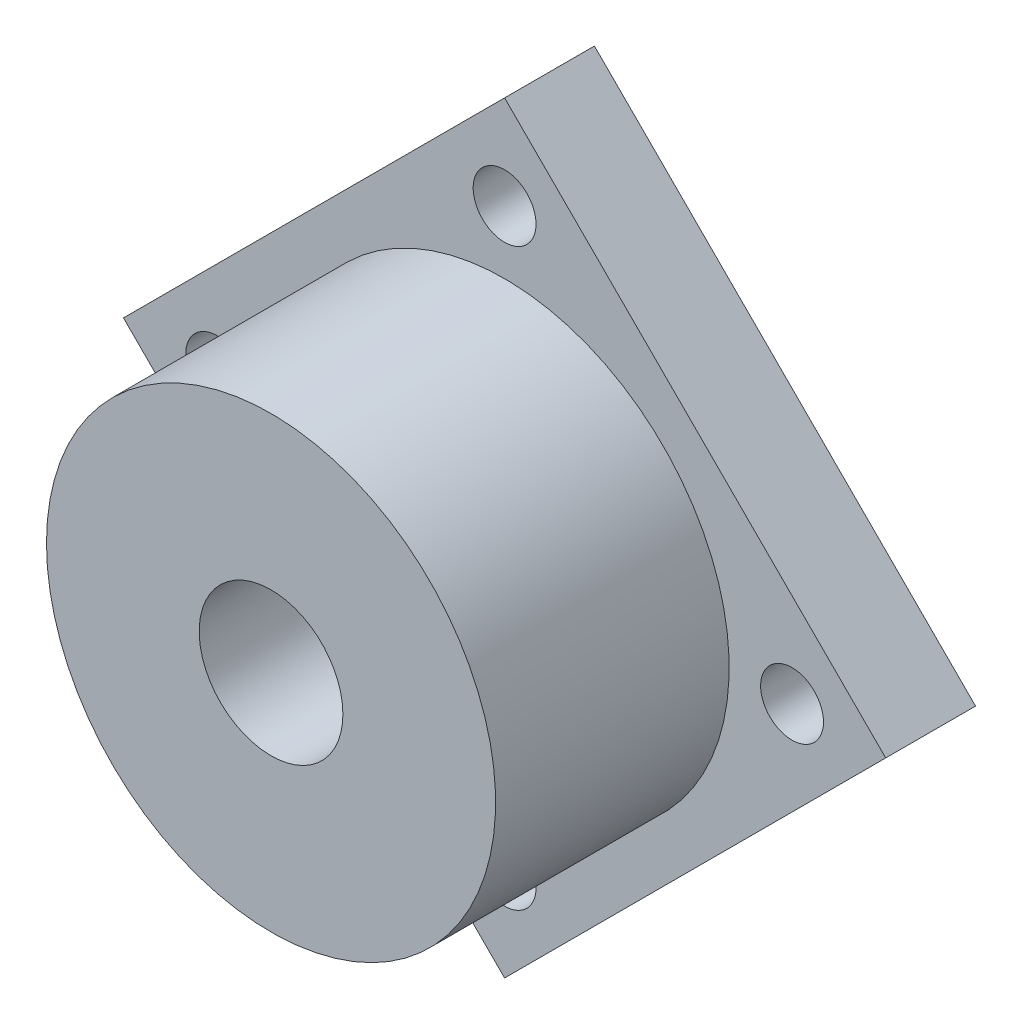
ISO-10303-21;
HEADER;
FILE_DESCRIPTION(('STEP AP214'),'2;1');
FILE_NAME('part.step','',(''),(''),'','','');
FILE_SCHEMA(('AUTOMOTIVE_DESIGN { 1 0 10303 214 1 1 1 1 }'));
ENDSEC;
DATA;
#1=APPLICATION_CONTEXT('core data for automotive mechanical design processes');
#2=APPLICATION_PROTOCOL_DEFINITION('international standard','automotive_design',2000,#1);
#3=PRODUCT_CONTEXT('',#1,'mechanical');
#4=PRODUCT('Part','Part','',(#3));
#5=PRODUCT_RELATED_PRODUCT_CATEGORY('part','',(#4));
#6=PRODUCT_DEFINITION_FORMATION('','',#4);
#7=PRODUCT_DEFINITION_CONTEXT('part definition',#1,'design');
#8=PRODUCT_DEFINITION('design','',#6,#7);
#9=PRODUCT_DEFINITION_SHAPE('','',#8);
#10=(LENGTH_UNIT() NAMED_UNIT(*) SI_UNIT(.MILLI.,.METRE.));
#11=(NAMED_UNIT(*) PLANE_ANGLE_UNIT() SI_UNIT($,.RADIAN.));
#12=(NAMED_UNIT(*) SI_UNIT($,.STERADIAN.) SOLID_ANGLE_UNIT());
#13=UNCERTAINTY_MEASURE_WITH_UNIT(LENGTH_MEASURE(1.E-05),#10,'distance_accuracy_value','');
#14=(GEOMETRIC_REPRESENTATION_CONTEXT(3) GLOBAL_UNCERTAINTY_ASSIGNED_CONTEXT((#13)) GLOBAL_UNIT_ASSIGNED_CONTEXT((#10,
#11,#12)) REPRESENTATION_CONTEXT('',''));
#15=CARTESIAN_POINT('',(0.,0.,0.));
#16=DIRECTION('',(0.,0.,1.));
#17=DIRECTION('',(1.,0.,0.));
#18=AXIS2_PLACEMENT_3D('',#15,#16,#17);
#19=CARTESIAN_POINT('',(0.,0.,5.));
#20=DIRECTION('',(0.,0.,1.));
#21=DIRECTION('',(1.,0.,0.));
#22=AXIS2_PLACEMENT_3D('',#19,#20,#21);
#23=PLANE('',#22);
#24=CARTESIAN_POINT('',(0.,0.,5.));
#25=DIRECTION('',(0.,0.,1.));
#26=DIRECTION('',(1.,0.,0.));
#27=AXIS2_PLACEMENT_3D('',#24,#25,#26);
#28=CIRCLE('',#27,12.5);
#29=CARTESIAN_POINT('',(-12.5,0.,5.));
#30=VERTEX_POINT('',#29);
#31=EDGE_CURVE('E11',#30,#30,#28,.T.);
#32=ORIENTED_EDGE('',*,*,#31,.F.);
#33=EDGE_LOOP('',(#32));
#34=FACE_BOUND('',#33,.T.);
#35=CARTESIAN_POINT('',(16.,0.,5.));
#36=DIRECTION('',(0.,0.,1.));
#37=DIRECTION('',(1.,0.,0.));
#38=AXIS2_PLACEMENT_3D('',#35,#36,#37);
#39=CIRCLE('',#38,1.75);
#40=CARTESIAN_POINT('',(17.75,0.,5.));
#41=VERTEX_POINT('',#40);
#42=EDGE_CURVE('E144',#41,#41,#39,.T.);
#43=ORIENTED_EDGE('',*,*,#42,.F.);
#44=EDGE_LOOP('',(#43));
#45=FACE_BOUND('',#44,.T.);
#46=CARTESIAN_POINT('',(0.,-16.,5.));
#47=DIRECTION('',(0.,0.,1.));
#48=DIRECTION('',(1.,0.,0.));
#49=AXIS2_PLACEMENT_3D('',#46,#47,#48);
#50=CIRCLE('',#49,1.75);
#51=CARTESIAN_POINT('',(1.74999999999994,-16.,5.));
#52=VERTEX_POINT('',#51);
#53=EDGE_CURVE('E141',#52,#52,#50,.T.);
#54=ORIENTED_EDGE('',*,*,#53,.F.);
#55=EDGE_LOOP('',(#54));
#56=FACE_BOUND('',#55,.T.);
#57=CARTESIAN_POINT('',(-16.,1.1172740284298E-13,5.));
#58=DIRECTION('',(0.,0.,1.));
#59=DIRECTION('',(1.,0.,0.));
#60=AXIS2_PLACEMENT_3D('',#57,#58,#59);
#61=CIRCLE('',#60,1.75);
#62=CARTESIAN_POINT('',(-14.25,1.1172740284298E-13,5.));
#63=VERTEX_POINT('',#62);
#64=EDGE_CURVE('E135',#63,#63,#61,.T.);
#65=ORIENTED_EDGE('',*,*,#64,.F.);
#66=EDGE_LOOP('',(#65));
#67=FACE_BOUND('',#66,.T.);
#68=CARTESIAN_POINT('',(1.6759110426447E-13,16.,5.));
#69=DIRECTION('',(0.,0.,1.));
#70=DIRECTION('',(1.,0.,0.));
#71=AXIS2_PLACEMENT_3D('',#68,#69,#70);
#72=CIRCLE('',#71,1.75);
#73=CARTESIAN_POINT('',(1.75000000000017,16.,5.));
#74=VERTEX_POINT('',#73);
#75=EDGE_CURVE('E128',#74,#74,#72,.T.);
#76=ORIENTED_EDGE('',*,*,#75,.F.);
#77=EDGE_LOOP('',(#76));
#78=FACE_BOUND('',#77,.T.);
#79=DIRECTION('',(-0.707106781186551,0.707106781186544,0.));
#80=VECTOR('',#79,1.);
#81=CARTESIAN_POINT('',(21.2132034355965,2.20897577713052E-13,5.));
#82=LINE('',#81,#80);
#83=CARTESIAN_POINT('',(21.2132034355965,2.20897577713052E-13,5.));
#84=VERTEX_POINT('',#83);
#85=CARTESIAN_POINT('',(0.,21.2132034355965,5.));
#86=VERTEX_POINT('',#85);
#87=EDGE_CURVE('E94',#84,#86,#82,.T.);
#88=ORIENTED_EDGE('',*,*,#87,.T.);
#89=DIRECTION('',(-0.707106781186546,-0.707106781186549,0.));
#90=VECTOR('',#89,1.);
#91=CARTESIAN_POINT('',(0.,21.2132034355965,5.));
#92=LINE('',#91,#90);
#93=CARTESIAN_POINT('',(-21.2132034355965,0.,5.));
#94=VERTEX_POINT('',#93);
#95=EDGE_CURVE('E90',#86,#94,#92,.T.);
#96=ORIENTED_EDGE('',*,*,#95,.T.);
#97=DIRECTION('',(0.707106781186551,-0.707106781186544,0.));
#98=VECTOR('',#97,1.);
#99=CARTESIAN_POINT('',(-21.2132034355965,0.,5.));
#100=LINE('',#99,#98);
#101=CARTESIAN_POINT('',(1.48131007864937E-13,-21.2132034355965,5.));
#102=VERTEX_POINT('',#101);
#103=EDGE_CURVE('E92',#94,#102,#100,.T.);
#104=ORIENTED_EDGE('',*,*,#103,.T.);
#105=DIRECTION('',(0.707106781186541,0.707106781186554,0.));
#106=VECTOR('',#105,1.);
#107=CARTESIAN_POINT('',(1.48131007864937E-13,-21.2132034355965,5.));
#108=LINE('',#107,#106);
#109=EDGE_CURVE('E59',#102,#84,#108,.T.);
#110=ORIENTED_EDGE('',*,*,#109,.T.);
#111=EDGE_LOOP('',(#88,#96,#104,#110));
#112=FACE_BOUND('',#111,.T.);
#113=ADVANCED_FACE('F41',(#34,#45,#56,#67,#78,#112),#23,.T.);
#114=CARTESIAN_POINT('',(0.,0.,0.));
#115=DIRECTION('',(0.,0.,1.));
#116=DIRECTION('',(1.,0.,0.));
#117=AXIS2_PLACEMENT_3D('',#114,#115,#116);
#118=PLANE('',#117);
#119=CARTESIAN_POINT('',(16.,0.,0.));
#120=DIRECTION('',(0.,0.,1.));
#121=DIRECTION('',(1.,0.,0.));
#122=AXIS2_PLACEMENT_3D('',#119,#120,#121);
#123=CIRCLE('',#122,1.75);
#124=CARTESIAN_POINT('',(17.75,0.,0.));
#125=VERTEX_POINT('',#124);
#126=EDGE_CURVE('E124',#125,#125,#123,.T.);
#127=ORIENTED_EDGE('',*,*,#126,.T.);
#128=EDGE_LOOP('',(#127));
#129=FACE_BOUND('',#128,.T.);
#130=CARTESIAN_POINT('',(0.,-16.,0.));
#131=DIRECTION('',(0.,0.,1.));
#132=DIRECTION('',(1.,0.,0.));
#133=AXIS2_PLACEMENT_3D('',#130,#131,#132);
#134=CIRCLE('',#133,1.75);
#135=CARTESIAN_POINT('',(1.74999999999994,-16.,0.));
#136=VERTEX_POINT('',#135);
#137=EDGE_CURVE('E138',#136,#136,#134,.T.);
#138=ORIENTED_EDGE('',*,*,#137,.T.);
#139=EDGE_LOOP('',(#138));
#140=FACE_BOUND('',#139,.T.);
#141=CARTESIAN_POINT('',(-16.,1.1172740284298E-13,0.));
#142=DIRECTION('',(0.,0.,1.));
#143=DIRECTION('',(1.,0.,0.));
#144=AXIS2_PLACEMENT_3D('',#141,#142,#143);
#145=CIRCLE('',#144,1.75);
#146=CARTESIAN_POINT('',(-14.25,1.1172740284298E-13,0.));
#147=VERTEX_POINT('',#146);
#148=EDGE_CURVE('E132',#147,#147,#145,.T.);
#149=ORIENTED_EDGE('',*,*,#148,.T.);
#150=EDGE_LOOP('',(#149));
#151=FACE_BOUND('',#150,.T.);
#152=CARTESIAN_POINT('',(1.6759110426447E-13,16.,0.));
#153=DIRECTION('',(0.,0.,1.));
#154=DIRECTION('',(1.,0.,0.));
#155=AXIS2_PLACEMENT_3D('',#152,#153,#154);
#156=CIRCLE('',#155,1.75);
#157=CARTESIAN_POINT('',(1.75000000000017,16.,0.));
#158=VERTEX_POINT('',#157);
#159=EDGE_CURVE('E125',#158,#158,#156,.T.);
#160=ORIENTED_EDGE('',*,*,#159,.T.);
#161=EDGE_LOOP('',(#160));
#162=FACE_BOUND('',#161,.T.);
#163=DIRECTION('',(-0.707106781186551,0.707106781186544,0.));
#164=VECTOR('',#163,1.);
#165=CARTESIAN_POINT('',(21.2132034355965,2.20897577713052E-13,0.));
#166=LINE('',#165,#164);
#167=CARTESIAN_POINT('',(21.2132034355965,2.20897577713052E-13,0.));
#168=VERTEX_POINT('',#167);
#169=CARTESIAN_POINT('',(0.,21.2132034355965,0.));
#170=VERTEX_POINT('',#169);
#171=EDGE_CURVE('E107',#168,#170,#166,.T.);
#172=ORIENTED_EDGE('',*,*,#171,.F.);
#173=DIRECTION('',(0.707106781186541,0.707106781186554,0.));
#174=VECTOR('',#173,1.);
#175=CARTESIAN_POINT('',(1.48131007864937E-13,-21.2132034355965,0.));
#176=LINE('',#175,#174);
#177=CARTESIAN_POINT('',(1.48131007864937E-13,-21.2132034355965,0.));
#178=VERTEX_POINT('',#177);
#179=EDGE_CURVE('E82',#178,#168,#176,.T.);
#180=ORIENTED_EDGE('',*,*,#179,.F.);
#181=DIRECTION('',(0.707106781186551,-0.707106781186544,0.));
#182=VECTOR('',#181,1.);
#183=CARTESIAN_POINT('',(-21.2132034355965,0.,0.));
#184=LINE('',#183,#182);
#185=CARTESIAN_POINT('',(-21.2132034355965,0.,0.));
#186=VERTEX_POINT('',#185);
#187=EDGE_CURVE('E76',#186,#178,#184,.T.);
#188=ORIENTED_EDGE('',*,*,#187,.F.);
#189=DIRECTION('',(-0.707106781186546,-0.707106781186549,0.));
#190=VECTOR('',#189,1.);
#191=CARTESIAN_POINT('',(0.,21.2132034355965,0.));
#192=LINE('',#191,#190);
#193=EDGE_CURVE('E99',#170,#186,#192,.T.);
#194=ORIENTED_EDGE('',*,*,#193,.F.);
#195=EDGE_LOOP('',(#172,#180,#188,#194));
#196=FACE_BOUND('',#195,.T.);
#197=CARTESIAN_POINT('',(0.,0.,0.));
#198=DIRECTION('',(0.,0.,1.));
#199=DIRECTION('',(1.,0.,0.));
#200=AXIS2_PLACEMENT_3D('',#197,#198,#199);
#201=CIRCLE('',#200,4.);
#202=CARTESIAN_POINT('',(4.,0.,0.));
#203=VERTEX_POINT('',#202);
#204=EDGE_CURVE('E110',#203,#203,#201,.T.);
#205=ORIENTED_EDGE('',*,*,#204,.T.);
#206=EDGE_LOOP('',(#205));
#207=FACE_BOUND('',#206,.T.);
#208=ADVANCED_FACE('F118',(#129,#140,#151,#162,#196,#207),#118,.F.);
#209=CARTESIAN_POINT('',(21.2132034355965,2.20897577713052E-13,5.));
#210=DIRECTION('',(-0.707106781186544,-0.707106781186551,0.));
#211=DIRECTION('',(0.707106781186551,-0.707106781186544,0.));
#212=AXIS2_PLACEMENT_3D('',#209,#210,#211);
#213=PLANE('',#212);
#214=ORIENTED_EDGE('',*,*,#171,.T.);
#215=DIRECTION('',(0.,0.,-1.));
#216=VECTOR('',#215,1.);
#217=CARTESIAN_POINT('',(0.,21.2132034355965,5.));
#218=LINE('',#217,#216);
#219=EDGE_CURVE('E45',#86,#170,#218,.T.);
#220=ORIENTED_EDGE('',*,*,#219,.F.);
#221=ORIENTED_EDGE('',*,*,#87,.F.);
#222=DIRECTION('',(0.,0.,-1.));
#223=VECTOR('',#222,1.);
#224=CARTESIAN_POINT('',(21.2132034355965,2.20897577713052E-13,5.));
#225=LINE('',#224,#223);
#226=EDGE_CURVE('E103',#84,#168,#225,.T.);
#227=ORIENTED_EDGE('',*,*,#226,.T.);
#228=EDGE_LOOP('',(#214,#220,#221,#227));
#229=FACE_BOUND('',#228,.T.);
#230=ADVANCED_FACE('F43',(#229),#213,.F.);
#231=CARTESIAN_POINT('',(0.,21.2132034355965,5.));
#232=DIRECTION('',(0.707106781186549,-0.707106781186546,0.));
#233=DIRECTION('',(0.707106781186546,0.707106781186549,0.));
#234=AXIS2_PLACEMENT_3D('',#231,#232,#233);
#235=PLANE('',#234);
#236=ORIENTED_EDGE('',*,*,#193,.T.);
#237=DIRECTION('',(0.,0.,-1.));
#238=VECTOR('',#237,1.);
#239=CARTESIAN_POINT('',(-21.2132034355965,0.,5.));
#240=LINE('',#239,#238);
#241=EDGE_CURVE('E97',#94,#186,#240,.T.);
#242=ORIENTED_EDGE('',*,*,#241,.F.);
#243=ORIENTED_EDGE('',*,*,#95,.F.);
#244=ORIENTED_EDGE('',*,*,#219,.T.);
#245=EDGE_LOOP('',(#236,#242,#243,#244));
#246=FACE_BOUND('',#245,.T.);
#247=ADVANCED_FACE('F98',(#246),#235,.F.);
#248=CARTESIAN_POINT('',(-21.2132034355965,0.,5.));
#249=DIRECTION('',(0.707106781186544,0.707106781186551,0.));
#250=DIRECTION('',(-0.707106781186551,0.707106781186544,0.));
#251=AXIS2_PLACEMENT_3D('',#248,#249,#250);
#252=PLANE('',#251);
#253=ORIENTED_EDGE('',*,*,#187,.T.);
#254=DIRECTION('',(0.,0.,-1.));
#255=VECTOR('',#254,1.);
#256=CARTESIAN_POINT('',(1.48131007864937E-13,-21.2132034355965,5.));
#257=LINE('',#256,#255);
#258=EDGE_CURVE('E100',#102,#178,#257,.T.);
#259=ORIENTED_EDGE('',*,*,#258,.F.);
#260=ORIENTED_EDGE('',*,*,#103,.F.);
#261=ORIENTED_EDGE('',*,*,#241,.T.);
#262=EDGE_LOOP('',(#253,#259,#260,#261));
#263=FACE_BOUND('',#262,.T.);
#264=ADVANCED_FACE('F101',(#263),#252,.F.);
#265=CARTESIAN_POINT('',(1.48131007864937E-13,-21.2132034355965,5.));
#266=DIRECTION('',(-0.707106781186554,0.707106781186541,0.));
#267=DIRECTION('',(-0.707106781186541,-0.707106781186554,0.));
#268=AXIS2_PLACEMENT_3D('',#265,#266,#267);
#269=PLANE('',#268);
#270=ORIENTED_EDGE('',*,*,#179,.T.);
#271=ORIENTED_EDGE('',*,*,#226,.F.);
#272=ORIENTED_EDGE('',*,*,#109,.F.);
#273=ORIENTED_EDGE('',*,*,#258,.T.);
#274=EDGE_LOOP('',(#270,#271,#272,#273));
#275=FACE_BOUND('',#274,.T.);
#276=ADVANCED_FACE('F115',(#275),#269,.F.);
#277=CARTESIAN_POINT('',(0.,0.,5.));
#278=DIRECTION('',(0.,0.,-1.));
#279=DIRECTION('',(-1.,0.,0.));
#280=AXIS2_PLACEMENT_3D('',#277,#278,#279);
#281=CYLINDRICAL_SURFACE('',#280,4.);
#282=ORIENTED_EDGE('',*,*,#204,.F.);
#283=EDGE_LOOP('',(#282));
#284=FACE_BOUND('',#283,.T.);
#285=CARTESIAN_POINT('',(0.,0.,18.));
#286=DIRECTION('',(0.,0.,1.));
#287=DIRECTION('',(1.,0.,0.));
#288=AXIS2_PLACEMENT_3D('',#285,#286,#287);
#289=CIRCLE('',#288,4.);
#290=CARTESIAN_POINT('',(4.,0.,18.));
#291=VERTEX_POINT('',#290);
#292=EDGE_CURVE('E151',#291,#291,#289,.T.);
#293=ORIENTED_EDGE('',*,*,#292,.T.);
#294=EDGE_LOOP('',(#293));
#295=FACE_BOUND('',#294,.T.);
#296=ADVANCED_FACE('F155',(#284,#295),#281,.F.);
#297=CARTESIAN_POINT('',(1.6759110426447E-13,16.,0.));
#298=DIRECTION('',(0.,0.,1.));
#299=DIRECTION('',(1.,0.,0.));
#300=AXIS2_PLACEMENT_3D('',#297,#298,#299);
#301=CYLINDRICAL_SURFACE('',#300,1.75);
#302=ORIENTED_EDGE('',*,*,#159,.F.);
#303=EDGE_LOOP('',(#302));
#304=FACE_BOUND('',#303,.T.);
#305=ORIENTED_EDGE('',*,*,#75,.T.);
#306=EDGE_LOOP('',(#305));
#307=FACE_BOUND('',#306,.T.);
#308=ADVANCED_FACE('F225',(#304,#307),#301,.F.);
#309=CARTESIAN_POINT('',(-16.,1.1172740284298E-13,0.));
#310=DIRECTION('',(0.,0.,1.));
#311=DIRECTION('',(1.,0.,0.));
#312=AXIS2_PLACEMENT_3D('',#309,#310,#311);
#313=CYLINDRICAL_SURFACE('',#312,1.75);
#314=ORIENTED_EDGE('',*,*,#148,.F.);
#315=EDGE_LOOP('',(#314));
#316=FACE_BOUND('',#315,.T.);
#317=ORIENTED_EDGE('',*,*,#64,.T.);
#318=EDGE_LOOP('',(#317));
#319=FACE_BOUND('',#318,.T.);
#320=ADVANCED_FACE('F236',(#316,#319),#313,.F.);
#321=CARTESIAN_POINT('',(0.,-16.,0.));
#322=DIRECTION('',(0.,0.,1.));
#323=DIRECTION('',(1.,0.,0.));
#324=AXIS2_PLACEMENT_3D('',#321,#322,#323);
#325=CYLINDRICAL_SURFACE('',#324,1.75);
#326=ORIENTED_EDGE('',*,*,#137,.F.);
#327=EDGE_LOOP('',(#326));
#328=FACE_BOUND('',#327,.T.);
#329=ORIENTED_EDGE('',*,*,#53,.T.);
#330=EDGE_LOOP('',(#329));
#331=FACE_BOUND('',#330,.T.);
#332=ADVANCED_FACE('F170',(#328,#331),#325,.F.);
#333=CARTESIAN_POINT('',(16.,0.,0.));
#334=DIRECTION('',(0.,0.,1.));
#335=DIRECTION('',(1.,0.,0.));
#336=AXIS2_PLACEMENT_3D('',#333,#334,#335);
#337=CYLINDRICAL_SURFACE('',#336,1.75);
#338=ORIENTED_EDGE('',*,*,#126,.F.);
#339=EDGE_LOOP('',(#338));
#340=FACE_BOUND('',#339,.T.);
#341=ORIENTED_EDGE('',*,*,#42,.T.);
#342=EDGE_LOOP('',(#341));
#343=FACE_BOUND('',#342,.T.);
#344=ADVANCED_FACE('F160',(#340,#343),#337,.F.);
#345=CARTESIAN_POINT('',(0.,0.,18.));
#346=DIRECTION('',(0.,0.,1.));
#347=DIRECTION('',(1.,0.,0.));
#348=AXIS2_PLACEMENT_3D('',#345,#346,#347);
#349=PLANE('',#348);
#350=CARTESIAN_POINT('',(0.,0.,18.));
#351=DIRECTION('',(0.,0.,1.));
#352=DIRECTION('',(1.,0.,0.));
#353=AXIS2_PLACEMENT_3D('',#350,#351,#352);
#354=CIRCLE('',#353,12.5);
#355=CARTESIAN_POINT('',(-12.5,0.,18.));
#356=VERTEX_POINT('',#355);
#357=EDGE_CURVE('E129',#356,#356,#354,.T.);
#358=ORIENTED_EDGE('',*,*,#357,.T.);
#359=EDGE_LOOP('',(#358));
#360=FACE_BOUND('',#359,.T.);
#361=ORIENTED_EDGE('',*,*,#292,.F.);
#362=EDGE_LOOP('',(#361));
#363=FACE_BOUND('',#362,.T.);
#364=ADVANCED_FACE('F157',(#360,#363),#349,.T.);
#365=CARTESIAN_POINT('',(0.,0.,18.));
#366=DIRECTION('',(0.,0.,-1.));
#367=DIRECTION('',(-1.,0.,0.));
#368=AXIS2_PLACEMENT_3D('',#365,#366,#367);
#369=CYLINDRICAL_SURFACE('',#368,12.5);
#370=CARTESIAN_POINT('',(-12.5,0.,18.));
#371=CARTESIAN_POINT('',(-12.5,0.,17.8645833333333));
#372=CARTESIAN_POINT('',(-12.5,0.,17.7291666666667));
#373=CARTESIAN_POINT('',(-12.5,0.,17.4583333333333));
#374=CARTESIAN_POINT('',(-12.5,0.,17.3229166666667));
#375=CARTESIAN_POINT('',(-12.5,0.,17.0520833333333));
#376=CARTESIAN_POINT('',(-12.5,0.,16.9166666666667));
#377=CARTESIAN_POINT('',(-12.5,0.,16.6458333333333));
#378=CARTESIAN_POINT('',(-12.5,0.,16.5104166666667));
#379=CARTESIAN_POINT('',(-12.5,0.,16.2395833333333));
#380=CARTESIAN_POINT('',(-12.5,0.,16.1041666666667));
#381=CARTESIAN_POINT('',(-12.5,0.,15.8333333333333));
#382=CARTESIAN_POINT('',(-12.5,0.,15.6979166666667));
#383=CARTESIAN_POINT('',(-12.5,0.,15.4270833333333));
#384=CARTESIAN_POINT('',(-12.5,0.,15.2916666666667));
#385=CARTESIAN_POINT('',(-12.5,0.,15.0208333333333));
#386=CARTESIAN_POINT('',(-12.5,0.,14.8854166666667));
#387=CARTESIAN_POINT('',(-12.5,0.,14.6145833333333));
#388=CARTESIAN_POINT('',(-12.5,0.,14.4791666666667));
#389=CARTESIAN_POINT('',(-12.5,0.,14.2083333333333));
#390=CARTESIAN_POINT('',(-12.5,0.,14.0729166666667));
#391=CARTESIAN_POINT('',(-12.5,0.,13.8020833333333));
#392=CARTESIAN_POINT('',(-12.5,0.,13.6666666666667));
#393=CARTESIAN_POINT('',(-12.5,0.,13.3958333333333));
#394=CARTESIAN_POINT('',(-12.5,0.,13.2604166666667));
#395=CARTESIAN_POINT('',(-12.5,0.,12.9895833333333));
#396=CARTESIAN_POINT('',(-12.5,0.,12.8541666666667));
#397=CARTESIAN_POINT('',(-12.5,0.,12.5833333333333));
#398=CARTESIAN_POINT('',(-12.5,0.,12.4479166666667));
#399=CARTESIAN_POINT('',(-12.5,0.,12.1770833333333));
#400=CARTESIAN_POINT('',(-12.5,0.,12.0416666666667));
#401=CARTESIAN_POINT('',(-12.5,0.,11.7708333333333));
#402=CARTESIAN_POINT('',(-12.5,0.,11.6354166666667));
#403=CARTESIAN_POINT('',(-12.5,0.,11.3645833333333));
#404=CARTESIAN_POINT('',(-12.5,0.,11.2291666666667));
#405=CARTESIAN_POINT('',(-12.5,0.,10.9583333333333));
#406=CARTESIAN_POINT('',(-12.5,0.,10.8229166666667));
#407=CARTESIAN_POINT('',(-12.5,0.,10.5520833333333));
#408=CARTESIAN_POINT('',(-12.5,0.,10.4166666666667));
#409=CARTESIAN_POINT('',(-12.5,0.,10.1458333333333));
#410=CARTESIAN_POINT('',(-12.5,0.,10.0104166666667));
#411=CARTESIAN_POINT('',(-12.5,0.,9.73958333333333));
#412=CARTESIAN_POINT('',(-12.5,0.,9.60416666666667));
#413=CARTESIAN_POINT('',(-12.5,0.,9.33333333333333));
#414=CARTESIAN_POINT('',(-12.5,0.,9.19791666666667));
#415=CARTESIAN_POINT('',(-12.5,0.,8.92708333333333));
#416=CARTESIAN_POINT('',(-12.5,0.,8.79166666666667));
#417=CARTESIAN_POINT('',(-12.5,0.,8.52083333333333));
#418=CARTESIAN_POINT('',(-12.5,0.,8.38541666666667));
#419=CARTESIAN_POINT('',(-12.5,0.,8.11458333333333));
#420=CARTESIAN_POINT('',(-12.5,0.,7.97916666666667));
#421=CARTESIAN_POINT('',(-12.5,0.,7.70833333333333));
#422=CARTESIAN_POINT('',(-12.5,0.,7.57291666666667));
#423=CARTESIAN_POINT('',(-12.5,0.,7.30208333333333));
#424=CARTESIAN_POINT('',(-12.5,0.,7.16666666666667));
#425=CARTESIAN_POINT('',(-12.5,0.,6.89583333333333));
#426=CARTESIAN_POINT('',(-12.5,0.,6.76041666666667));
#427=CARTESIAN_POINT('',(-12.5,0.,6.48958333333333));
#428=CARTESIAN_POINT('',(-12.5,0.,6.35416666666667));
#429=CARTESIAN_POINT('',(-12.5,0.,6.08333333333333));
#430=CARTESIAN_POINT('',(-12.5,0.,5.94791666666667));
#431=CARTESIAN_POINT('',(-12.5,0.,5.67708333333333));
#432=CARTESIAN_POINT('',(-12.5,0.,5.54166666666667));
#433=CARTESIAN_POINT('',(-12.5,0.,5.27083333333333));
#434=CARTESIAN_POINT('',(-12.5,0.,5.13541666666667));
#435=CARTESIAN_POINT('',(-12.5,0.,5.));
#436=B_SPLINE_CURVE_WITH_KNOTS('',3,(#370,#371,#372,#373,#374,#375,#376,#377,#378,#379,#380,
#381,#382,#383,#384,#385,#386,#387,#388,#389,#390,#391,#392,#393,#394,#395,#396,#397,#398,#399,
#400,#401,#402,#403,#404,#405,#406,#407,#408,#409,#410,#411,#412,#413,#414,#415,#416,#417,#418,
#419,#420,#421,#422,#423,#424,#425,#426,#427,#428,#429,#430,#431,#432,#433,#434,#435),
.UNSPECIFIED.,.F.,.F.,(4,2,2,2,2,2,2,2,2,2,2,2,2,2,2,2,2,2,2,2,2,2,2,2,2,2,2,2,2,2,2,2,4),(0.,
0.40625,0.812500000000001,1.21875,1.625,2.03125,2.4375,2.84375,3.25,3.65625,4.0625,4.46875,
4.875,5.28125,5.6875,6.09375,6.5,6.90625,7.3125,7.71875,8.125,8.53125,8.9375,9.34375,9.75,
10.15625,10.5625,10.96875,11.375,11.78125,12.1875,12.59375,13.),.UNSPECIFIED.);
#437=EDGE_CURVE('BSEAM159',#356,#30,#436,.T.);
#438=ORIENTED_EDGE('',*,*,#357,.F.);
#439=ORIENTED_EDGE('',*,*,#31,.T.);
#440=ORIENTED_EDGE('',*,*,#437,.T.);
#441=ORIENTED_EDGE('',*,*,#437,.F.);
#442=EDGE_LOOP('',(#438,#440,#439,#441));
#443=FACE_BOUND('',#442,.T.);
#444=ADVANCED_FACE('F159',(#443),#369,.T.);
#445=CLOSED_SHELL('',(#113,#208,#230,#247,#264,#276,#296,#308,#320,#332,#344,#364,#444));
#446=MANIFOLD_SOLID_BREP('B2',#445);
#447=ADVANCED_BREP_SHAPE_REPRESENTATION('',(#18,#446),#14);
#448=SHAPE_DEFINITION_REPRESENTATION(#9,#447);
ENDSEC;
END-ISO-10303-21;
